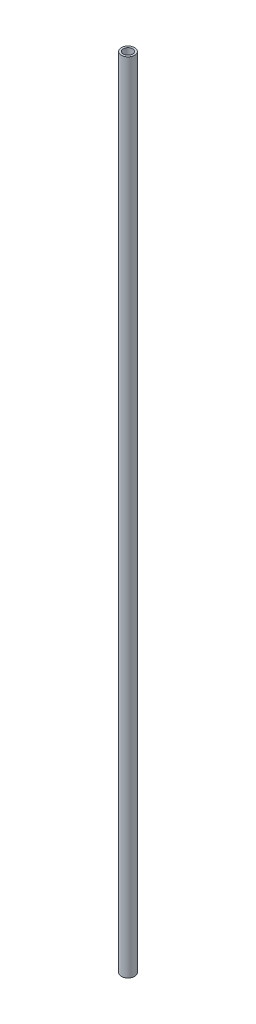
ISO-10303-21;
HEADER;
FILE_DESCRIPTION(('STEP AP214'),'2;1');
FILE_NAME('part.step','',(''),(''),'','','');
FILE_SCHEMA(('AUTOMOTIVE_DESIGN { 1 0 10303 214 1 1 1 1 }'));
ENDSEC;
DATA;
#1=APPLICATION_CONTEXT('core data for automotive mechanical design processes');
#2=APPLICATION_PROTOCOL_DEFINITION('international standard','automotive_design',2000,#1);
#3=PRODUCT_CONTEXT('',#1,'mechanical');
#4=PRODUCT('Part','Part','',(#3));
#5=PRODUCT_RELATED_PRODUCT_CATEGORY('part','',(#4));
#6=PRODUCT_DEFINITION_FORMATION('','',#4);
#7=PRODUCT_DEFINITION_CONTEXT('part definition',#1,'design');
#8=PRODUCT_DEFINITION('design','',#6,#7);
#9=PRODUCT_DEFINITION_SHAPE('','',#8);
#10=(LENGTH_UNIT() NAMED_UNIT(*) SI_UNIT(.MILLI.,.METRE.));
#11=(NAMED_UNIT(*) PLANE_ANGLE_UNIT() SI_UNIT($,.RADIAN.));
#12=(NAMED_UNIT(*) SI_UNIT($,.STERADIAN.) SOLID_ANGLE_UNIT());
#13=UNCERTAINTY_MEASURE_WITH_UNIT(LENGTH_MEASURE(1.E-05),#10,'distance_accuracy_value','');
#14=(GEOMETRIC_REPRESENTATION_CONTEXT(3) GLOBAL_UNCERTAINTY_ASSIGNED_CONTEXT((#13)) GLOBAL_UNIT_ASSIGNED_CONTEXT((#10,
#11,#12)) REPRESENTATION_CONTEXT('',''));
#15=CARTESIAN_POINT('',(0.,0.,0.));
#16=DIRECTION('',(0.,0.,1.));
#17=DIRECTION('',(1.,0.,0.));
#18=AXIS2_PLACEMENT_3D('',#15,#16,#17);
#19=CARTESIAN_POINT('',(0.,600.,0.));
#20=DIRECTION('',(0.,1.,0.));
#21=DIRECTION('',(0.,0.,1.));
#22=AXIS2_PLACEMENT_3D('',#19,#20,#21);
#23=PLANE('',#22);
#24=CARTESIAN_POINT('',(0.,600.,0.));
#25=DIRECTION('',(0.,1.,0.));
#26=DIRECTION('',(0.,0.,1.));
#27=AXIS2_PLACEMENT_3D('',#24,#25,#26);
#28=CIRCLE('',#27,5.);
#29=CARTESIAN_POINT('',(0.,600.,5.));
#30=VERTEX_POINT('',#29);
#31=EDGE_CURVE('E10',#30,#30,#28,.T.);
#32=ORIENTED_EDGE('',*,*,#31,.T.);
#33=EDGE_LOOP('',(#32));
#34=FACE_BOUND('',#33,.T.);
#35=CARTESIAN_POINT('',(0.,600.,0.));
#36=DIRECTION('',(0.,1.,0.));
#37=DIRECTION('',(0.,0.,1.));
#38=AXIS2_PLACEMENT_3D('',#35,#36,#37);
#39=CIRCLE('',#38,3.5);
#40=CARTESIAN_POINT('',(0.,600.,3.5));
#41=VERTEX_POINT('',#40);
#42=EDGE_CURVE('E45',#41,#41,#39,.T.);
#43=ORIENTED_EDGE('',*,*,#42,.F.);
#44=EDGE_LOOP('',(#43));
#45=FACE_BOUND('',#44,.T.);
#46=ADVANCED_FACE('F34',(#34,#45),#23,.T.);
#47=CARTESIAN_POINT('',(0.,0.,0.));
#48=DIRECTION('',(0.,1.,0.));
#49=DIRECTION('',(0.,0.,1.));
#50=AXIS2_PLACEMENT_3D('',#47,#48,#49);
#51=PLANE('',#50);
#52=CARTESIAN_POINT('',(0.,0.,0.));
#53=DIRECTION('',(0.,1.,0.));
#54=DIRECTION('',(0.,0.,1.));
#55=AXIS2_PLACEMENT_3D('',#52,#53,#54);
#56=CIRCLE('',#55,5.);
#57=CARTESIAN_POINT('',(0.,0.,5.));
#58=VERTEX_POINT('',#57);
#59=EDGE_CURVE('E38',#58,#58,#56,.T.);
#60=ORIENTED_EDGE('',*,*,#59,.F.);
#61=EDGE_LOOP('',(#60));
#62=FACE_BOUND('',#61,.T.);
#63=CARTESIAN_POINT('',(0.,0.,0.));
#64=DIRECTION('',(0.,1.,0.));
#65=DIRECTION('',(0.,0.,1.));
#66=AXIS2_PLACEMENT_3D('',#63,#64,#65);
#67=CIRCLE('',#66,3.5);
#68=CARTESIAN_POINT('',(0.,0.,3.5));
#69=VERTEX_POINT('',#68);
#70=EDGE_CURVE('E47',#69,#69,#67,.T.);
#71=ORIENTED_EDGE('',*,*,#70,.T.);
#72=EDGE_LOOP('',(#71));
#73=FACE_BOUND('',#72,.T.);
#74=ADVANCED_FACE('F57',(#62,#73),#51,.F.);
#75=CARTESIAN_POINT('',(0.,600.,0.));
#76=DIRECTION('',(0.,-1.,0.));
#77=DIRECTION('',(0.,0.,-1.));
#78=AXIS2_PLACEMENT_3D('',#75,#76,#77);
#79=CYLINDRICAL_SURFACE('',#78,5.);
#80=ORIENTED_EDGE('',*,*,#31,.F.);
#81=EDGE_LOOP('',(#80));
#82=FACE_BOUND('',#81,.T.);
#83=ORIENTED_EDGE('',*,*,#59,.T.);
#84=EDGE_LOOP('',(#83));
#85=FACE_BOUND('',#84,.T.);
#86=ADVANCED_FACE('F36',(#82,#85),#79,.T.);
#87=CARTESIAN_POINT('',(0.,600.,0.));
#88=DIRECTION('',(0.,-1.,0.));
#89=DIRECTION('',(0.,0.,-1.));
#90=AXIS2_PLACEMENT_3D('',#87,#88,#89);
#91=CYLINDRICAL_SURFACE('',#90,3.5);
#92=ORIENTED_EDGE('',*,*,#42,.T.);
#93=EDGE_LOOP('',(#92));
#94=FACE_BOUND('',#93,.T.);
#95=ORIENTED_EDGE('',*,*,#70,.F.);
#96=EDGE_LOOP('',(#95));
#97=FACE_BOUND('',#96,.T.);
#98=ADVANCED_FACE('F53',(#94,#97),#91,.F.);
#99=CLOSED_SHELL('',(#46,#74,#86,#98));
#100=MANIFOLD_SOLID_BREP('B2',#99);
#101=ADVANCED_BREP_SHAPE_REPRESENTATION('',(#18,#100),#14);
#102=SHAPE_DEFINITION_REPRESENTATION(#9,#101);
ENDSEC;
END-ISO-10303-21;
